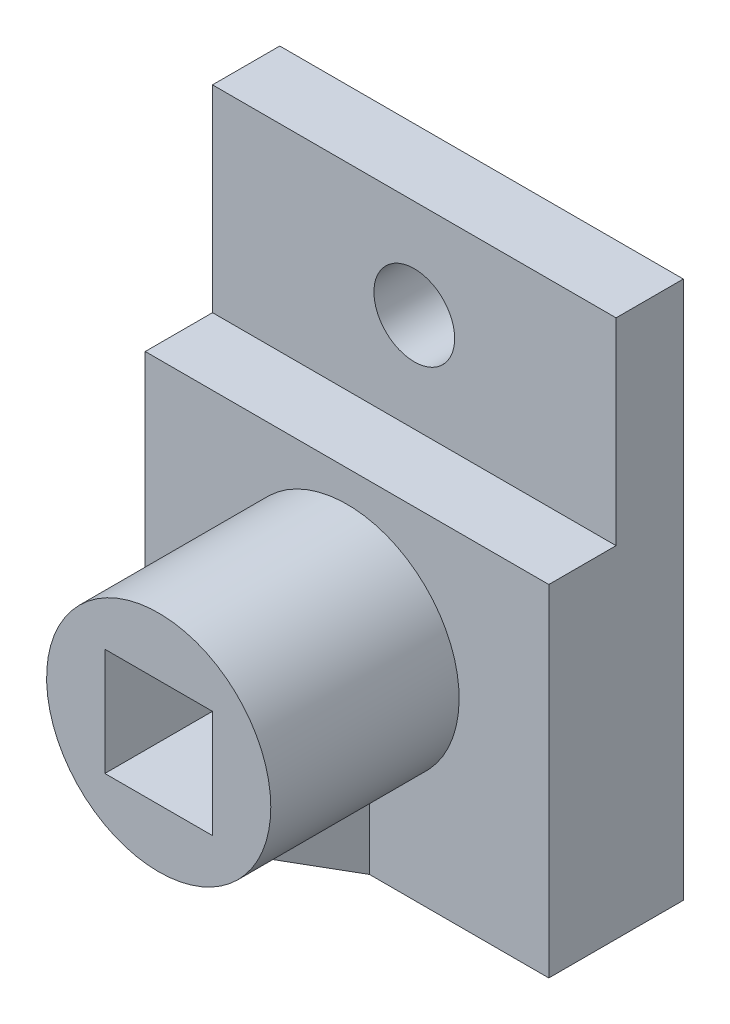
ISO-10303-21;
HEADER;
FILE_DESCRIPTION(('STEP AP214'),'2;1');
FILE_NAME('part.step','',(''),(''),'','','');
FILE_SCHEMA(('AUTOMOTIVE_DESIGN { 1 0 10303 214 1 1 1 1 }'));
ENDSEC;
DATA;
#1=APPLICATION_CONTEXT('core data for automotive mechanical design processes');
#2=APPLICATION_PROTOCOL_DEFINITION('international standard','automotive_design',2000,#1);
#3=PRODUCT_CONTEXT('',#1,'mechanical');
#4=PRODUCT('Part','Part','',(#3));
#5=PRODUCT_RELATED_PRODUCT_CATEGORY('part','',(#4));
#6=PRODUCT_DEFINITION_FORMATION('','',#4);
#7=PRODUCT_DEFINITION_CONTEXT('part definition',#1,'design');
#8=PRODUCT_DEFINITION('design','',#6,#7);
#9=PRODUCT_DEFINITION_SHAPE('','',#8);
#10=(LENGTH_UNIT() NAMED_UNIT(*) SI_UNIT(.MILLI.,.METRE.));
#11=(NAMED_UNIT(*) PLANE_ANGLE_UNIT() SI_UNIT($,.RADIAN.));
#12=(NAMED_UNIT(*) SI_UNIT($,.STERADIAN.) SOLID_ANGLE_UNIT());
#13=UNCERTAINTY_MEASURE_WITH_UNIT(LENGTH_MEASURE(1.E-05),#10,'distance_accuracy_value','');
#14=(GEOMETRIC_REPRESENTATION_CONTEXT(3) GLOBAL_UNCERTAINTY_ASSIGNED_CONTEXT((#13)) GLOBAL_UNIT_ASSIGNED_CONTEXT((#10,
#11,#12)) REPRESENTATION_CONTEXT('',''));
#15=CARTESIAN_POINT('',(0.,0.,0.));
#16=DIRECTION('',(0.,0.,1.));
#17=DIRECTION('',(1.,0.,0.));
#18=AXIS2_PLACEMENT_3D('',#15,#16,#17);
#19=CARTESIAN_POINT('',(0.,0.,15.));
#20=DIRECTION('',(0.,0.,-1.));
#21=DIRECTION('',(-1.,0.,0.));
#22=AXIS2_PLACEMENT_3D('',#19,#20,#21);
#23=PLANE('',#22);
#24=DIRECTION('',(0.,1.,0.));
#25=VECTOR('',#24,1.);
#26=CARTESIAN_POINT('',(22.5,-30.,15.));
#27=LINE('',#26,#25);
#28=CARTESIAN_POINT('',(22.5,-30.,15.));
#29=VERTEX_POINT('',#28);
#30=CARTESIAN_POINT('',(22.5,8.00000000000001,15.));
#31=VERTEX_POINT('',#30);
#32=EDGE_CURVE('E214',#29,#31,#27,.T.);
#33=ORIENTED_EDGE('',*,*,#32,.T.);
#34=DIRECTION('',(1.,0.,0.));
#35=VECTOR('',#34,1.);
#36=CARTESIAN_POINT('',(-22.5,8.00000000000001,15.));
#37=LINE('',#36,#35);
#38=CARTESIAN_POINT('',(-22.5,8.00000000000001,15.));
#39=VERTEX_POINT('',#38);
#40=EDGE_CURVE('E203',#39,#31,#37,.T.);
#41=ORIENTED_EDGE('',*,*,#40,.F.);
#42=DIRECTION('',(0.,-1.,0.));
#43=VECTOR('',#42,1.);
#44=CARTESIAN_POINT('',(-22.5,-30.,15.));
#45=LINE('',#44,#43);
#46=CARTESIAN_POINT('',(-22.5,-30.,15.));
#47=VERTEX_POINT('',#46);
#48=EDGE_CURVE('E217',#39,#47,#45,.T.);
#49=ORIENTED_EDGE('',*,*,#48,.T.);
#50=DIRECTION('',(1.,0.,0.));
#51=VECTOR('',#50,1.);
#52=CARTESIAN_POINT('',(-22.5,-30.,15.));
#53=LINE('',#52,#51);
#54=CARTESIAN_POINT('',(-2.50000000000001,-30.,15.));
#55=VERTEX_POINT('',#54);
#56=EDGE_CURVE('E221',#47,#55,#53,.T.);
#57=ORIENTED_EDGE('',*,*,#56,.T.);
#58=DIRECTION('',(0.,-1.,0.));
#59=VECTOR('',#58,1.);
#60=CARTESIAN_POINT('',(-2.5,0.,15.));
#61=LINE('',#60,#59);
#62=CARTESIAN_POINT('',(-2.5,-20.2474487139159,15.));
#63=VERTEX_POINT('',#62);
#64=EDGE_CURVE('E169',#63,#55,#61,.T.);
#65=ORIENTED_EDGE('',*,*,#64,.F.);
#66=CARTESIAN_POINT('',(0.,-7.99999999999999,15.));
#67=DIRECTION('',(0.,0.,-1.));
#68=DIRECTION('',(-1.,0.,0.));
#69=AXIS2_PLACEMENT_3D('',#66,#67,#68);
#70=CIRCLE('',#69,12.5);
#71=CARTESIAN_POINT('',(2.5,-20.2474487139159,15.));
#72=VERTEX_POINT('',#71);
#73=EDGE_CURVE('E11',#72,#63,#70,.F.);
#74=ORIENTED_EDGE('',*,*,#73,.F.);
#75=DIRECTION('',(0.,-1.,0.));
#76=VECTOR('',#75,1.);
#77=CARTESIAN_POINT('',(2.5,0.,15.));
#78=LINE('',#77,#76);
#79=CARTESIAN_POINT('',(2.49999999999999,-30.,15.));
#80=VERTEX_POINT('',#79);
#81=EDGE_CURVE('E177',#72,#80,#78,.T.);
#82=ORIENTED_EDGE('',*,*,#81,.T.);
#83=EDGE_CURVE('E220',#80,#29,#53,.T.);
#84=ORIENTED_EDGE('',*,*,#83,.T.);
#85=EDGE_LOOP('',(#33,#41,#49,#57,#65,#74,#82,#84));
#86=FACE_BOUND('',#85,.T.);
#87=ADVANCED_FACE('F35',(#86),#23,.F.);
#88=CARTESIAN_POINT('',(22.5,-30.,15.));
#89=DIRECTION('',(-1.,0.,0.));
#90=DIRECTION('',(0.,0.,1.));
#91=AXIS2_PLACEMENT_3D('',#88,#89,#90);
#92=PLANE('',#91);
#93=DIRECTION('',(0.,0.,-1.));
#94=VECTOR('',#93,1.);
#95=CARTESIAN_POINT('',(22.5,30.,15.));
#96=LINE('',#95,#94);
#97=CARTESIAN_POINT('',(22.5,30.,7.5));
#98=VERTEX_POINT('',#97);
#99=CARTESIAN_POINT('',(22.5,30.,0.));
#100=VERTEX_POINT('',#99);
#101=EDGE_CURVE('E43',#98,#100,#96,.T.);
#102=ORIENTED_EDGE('',*,*,#101,.F.);
#103=DIRECTION('',(0.,1.,0.));
#104=VECTOR('',#103,1.);
#105=CARTESIAN_POINT('',(22.5,30.,7.5));
#106=LINE('',#105,#104);
#107=CARTESIAN_POINT('',(22.5,8.00000000000001,7.5));
#108=VERTEX_POINT('',#107);
#109=EDGE_CURVE('E200',#108,#98,#106,.T.);
#110=ORIENTED_EDGE('',*,*,#109,.F.);
#111=DIRECTION('',(0.,0.,-1.));
#112=VECTOR('',#111,1.);
#113=CARTESIAN_POINT('',(22.5,8.00000000000001,15.));
#114=LINE('',#113,#112);
#115=EDGE_CURVE('E195',#31,#108,#114,.T.);
#116=ORIENTED_EDGE('',*,*,#115,.F.);
#117=ORIENTED_EDGE('',*,*,#32,.F.);
#118=DIRECTION('',(0.,0.,-1.));
#119=VECTOR('',#118,1.);
#120=CARTESIAN_POINT('',(22.5,-30.,15.));
#121=LINE('',#120,#119);
#122=CARTESIAN_POINT('',(22.5,-30.,0.));
#123=VERTEX_POINT('',#122);
#124=EDGE_CURVE('E224',#29,#123,#121,.T.);
#125=ORIENTED_EDGE('',*,*,#124,.T.);
#126=DIRECTION('',(0.,1.,0.));
#127=VECTOR('',#126,1.);
#128=CARTESIAN_POINT('',(22.5,-30.,0.));
#129=LINE('',#128,#127);
#130=EDGE_CURVE('E210',#123,#100,#129,.T.);
#131=ORIENTED_EDGE('',*,*,#130,.T.);
#132=EDGE_LOOP('',(#102,#110,#116,#117,#125,#131));
#133=FACE_BOUND('',#132,.T.);
#134=ADVANCED_FACE('F37',(#133),#92,.F.);
#135=CARTESIAN_POINT('',(-22.5,30.,15.));
#136=DIRECTION('',(0.,-1.,0.));
#137=DIRECTION('',(0.,0.,-1.));
#138=AXIS2_PLACEMENT_3D('',#135,#136,#137);
#139=PLANE('',#138);
#140=DIRECTION('',(-1.,0.,0.));
#141=VECTOR('',#140,1.);
#142=CARTESIAN_POINT('',(-22.5,30.,0.));
#143=LINE('',#142,#141);
#144=CARTESIAN_POINT('',(-22.5,30.,0.));
#145=VERTEX_POINT('',#144);
#146=EDGE_CURVE('E227',#100,#145,#143,.T.);
#147=ORIENTED_EDGE('',*,*,#146,.T.);
#148=DIRECTION('',(0.,0.,-1.));
#149=VECTOR('',#148,1.);
#150=CARTESIAN_POINT('',(-22.5,30.,15.));
#151=LINE('',#150,#149);
#152=CARTESIAN_POINT('',(-22.5,30.,7.5));
#153=VERTEX_POINT('',#152);
#154=EDGE_CURVE('E237',#153,#145,#151,.T.);
#155=ORIENTED_EDGE('',*,*,#154,.F.);
#156=DIRECTION('',(1.,0.,0.));
#157=VECTOR('',#156,1.);
#158=CARTESIAN_POINT('',(-22.5,30.,7.5));
#159=LINE('',#158,#157);
#160=EDGE_CURVE('E208',#153,#98,#159,.T.);
#161=ORIENTED_EDGE('',*,*,#160,.T.);
#162=ORIENTED_EDGE('',*,*,#101,.T.);
#163=EDGE_LOOP('',(#147,#155,#161,#162));
#164=FACE_BOUND('',#163,.T.);
#165=ADVANCED_FACE('F242',(#164),#139,.F.);
#166=CARTESIAN_POINT('',(-22.5,-30.,15.));
#167=DIRECTION('',(1.,0.,0.));
#168=DIRECTION('',(0.,0.,-1.));
#169=AXIS2_PLACEMENT_3D('',#166,#167,#168);
#170=PLANE('',#169);
#171=DIRECTION('',(0.,0.,-1.));
#172=VECTOR('',#171,1.);
#173=CARTESIAN_POINT('',(-22.5,8.00000000000001,15.));
#174=LINE('',#173,#172);
#175=CARTESIAN_POINT('',(-22.5,8.00000000000001,7.5));
#176=VERTEX_POINT('',#175);
#177=EDGE_CURVE('E196',#39,#176,#174,.T.);
#178=ORIENTED_EDGE('',*,*,#177,.T.);
#179=DIRECTION('',(0.,1.,0.));
#180=VECTOR('',#179,1.);
#181=CARTESIAN_POINT('',(-22.5,30.,7.5));
#182=LINE('',#181,#180);
#183=EDGE_CURVE('E199',#176,#153,#182,.T.);
#184=ORIENTED_EDGE('',*,*,#183,.T.);
#185=ORIENTED_EDGE('',*,*,#154,.T.);
#186=DIRECTION('',(0.,-1.,0.));
#187=VECTOR('',#186,1.);
#188=CARTESIAN_POINT('',(-22.5,-30.,0.));
#189=LINE('',#188,#187);
#190=CARTESIAN_POINT('',(-22.5,-30.,0.));
#191=VERTEX_POINT('',#190);
#192=EDGE_CURVE('E229',#145,#191,#189,.T.);
#193=ORIENTED_EDGE('',*,*,#192,.T.);
#194=DIRECTION('',(0.,0.,-1.));
#195=VECTOR('',#194,1.);
#196=CARTESIAN_POINT('',(-22.5,-30.,15.));
#197=LINE('',#196,#195);
#198=EDGE_CURVE('E234',#47,#191,#197,.T.);
#199=ORIENTED_EDGE('',*,*,#198,.F.);
#200=ORIENTED_EDGE('',*,*,#48,.F.);
#201=EDGE_LOOP('',(#178,#184,#185,#193,#199,#200));
#202=FACE_BOUND('',#201,.T.);
#203=ADVANCED_FACE('F260',(#202),#170,.F.);
#204=CARTESIAN_POINT('',(-22.5,-30.,15.));
#205=DIRECTION('',(0.,1.,0.));
#206=DIRECTION('',(0.,0.,1.));
#207=AXIS2_PLACEMENT_3D('',#204,#205,#206);
#208=PLANE('',#207);
#209=ORIENTED_EDGE('',*,*,#83,.F.);
#210=DIRECTION('',(1.,0.,0.));
#211=VECTOR('',#210,1.);
#212=CARTESIAN_POINT('',(-22.5,-30.,15.));
#213=LINE('',#212,#211);
#214=EDGE_CURVE('E183',#55,#80,#213,.T.);
#215=ORIENTED_EDGE('',*,*,#214,.F.);
#216=ORIENTED_EDGE('',*,*,#56,.F.);
#217=ORIENTED_EDGE('',*,*,#198,.T.);
#218=DIRECTION('',(1.,0.,0.));
#219=VECTOR('',#218,1.);
#220=CARTESIAN_POINT('',(-22.5,-30.,0.));
#221=LINE('',#220,#219);
#222=EDGE_CURVE('E218',#191,#123,#221,.T.);
#223=ORIENTED_EDGE('',*,*,#222,.T.);
#224=ORIENTED_EDGE('',*,*,#124,.F.);
#225=EDGE_LOOP('',(#209,#215,#216,#217,#223,#224));
#226=FACE_BOUND('',#225,.T.);
#227=ADVANCED_FACE('F255',(#226),#208,.F.);
#228=CARTESIAN_POINT('',(0.,0.,0.));
#229=DIRECTION('',(0.,0.,-1.));
#230=DIRECTION('',(-1.,0.,0.));
#231=AXIS2_PLACEMENT_3D('',#228,#229,#230);
#232=PLANE('',#231);
#233=DIRECTION('',(0.,1.,0.));
#234=VECTOR('',#233,1.);
#235=CARTESIAN_POINT('',(6.,-14.,0.));
#236=LINE('',#235,#234);
#237=CARTESIAN_POINT('',(6.,-14.,0.));
#238=VERTEX_POINT('',#237);
#239=CARTESIAN_POINT('',(6.,-1.99999999999999,0.));
#240=VERTEX_POINT('',#239);
#241=EDGE_CURVE('E131',#238,#240,#236,.T.);
#242=ORIENTED_EDGE('',*,*,#241,.T.);
#243=DIRECTION('',(-1.,0.,0.));
#244=VECTOR('',#243,1.);
#245=CARTESIAN_POINT('',(-6.,-1.99999999999999,0.));
#246=LINE('',#245,#244);
#247=CARTESIAN_POINT('',(-6.,-1.99999999999999,0.));
#248=VERTEX_POINT('',#247);
#249=EDGE_CURVE('E140',#240,#248,#246,.T.);
#250=ORIENTED_EDGE('',*,*,#249,.T.);
#251=DIRECTION('',(0.,-1.,0.));
#252=VECTOR('',#251,1.);
#253=CARTESIAN_POINT('',(-6.,-14.,0.));
#254=LINE('',#253,#252);
#255=CARTESIAN_POINT('',(-6.,-14.,0.));
#256=VERTEX_POINT('',#255);
#257=EDGE_CURVE('E50',#248,#256,#254,.T.);
#258=ORIENTED_EDGE('',*,*,#257,.T.);
#259=DIRECTION('',(1.,0.,0.));
#260=VECTOR('',#259,1.);
#261=CARTESIAN_POINT('',(-6.,-14.,0.));
#262=LINE('',#261,#260);
#263=EDGE_CURVE('E137',#256,#238,#262,.T.);
#264=ORIENTED_EDGE('',*,*,#263,.T.);
#265=EDGE_LOOP('',(#242,#250,#258,#264));
#266=FACE_BOUND('',#265,.T.);
#267=CARTESIAN_POINT('',(0.,19.,0.));
#268=DIRECTION('',(0.,0.,1.));
#269=DIRECTION('',(1.,0.,0.));
#270=AXIS2_PLACEMENT_3D('',#267,#268,#269);
#271=CIRCLE('',#270,4.5);
#272=CARTESIAN_POINT('',(4.5,19.,0.));
#273=VERTEX_POINT('',#272);
#274=EDGE_CURVE('E187',#273,#273,#271,.T.);
#275=ORIENTED_EDGE('',*,*,#274,.T.);
#276=EDGE_LOOP('',(#275));
#277=FACE_BOUND('',#276,.T.);
#278=ORIENTED_EDGE('',*,*,#192,.F.);
#279=ORIENTED_EDGE('',*,*,#146,.F.);
#280=ORIENTED_EDGE('',*,*,#130,.F.);
#281=ORIENTED_EDGE('',*,*,#222,.F.);
#282=EDGE_LOOP('',(#278,#279,#280,#281));
#283=FACE_BOUND('',#282,.T.);
#284=ADVANCED_FACE('F144',(#266,#277,#283),#232,.T.);
#285=CARTESIAN_POINT('',(-22.5,30.,7.5));
#286=DIRECTION('',(0.,0.,-1.));
#287=DIRECTION('',(0.,1.,0.));
#288=AXIS2_PLACEMENT_3D('',#285,#286,#287);
#289=PLANE('',#288);
#290=CARTESIAN_POINT('',(0.,19.,7.5));
#291=DIRECTION('',(0.,0.,1.));
#292=DIRECTION('',(1.,0.,0.));
#293=AXIS2_PLACEMENT_3D('',#290,#291,#292);
#294=CIRCLE('',#293,4.5);
#295=CARTESIAN_POINT('',(4.5,19.,7.5));
#296=VERTEX_POINT('',#295);
#297=EDGE_CURVE('E186',#296,#296,#294,.T.);
#298=ORIENTED_EDGE('',*,*,#297,.F.);
#299=EDGE_LOOP('',(#298));
#300=FACE_BOUND('',#299,.T.);
#301=ORIENTED_EDGE('',*,*,#109,.T.);
#302=ORIENTED_EDGE('',*,*,#160,.F.);
#303=ORIENTED_EDGE('',*,*,#183,.F.);
#304=DIRECTION('',(1.,0.,0.));
#305=VECTOR('',#304,1.);
#306=CARTESIAN_POINT('',(-22.5,8.00000000000001,7.5));
#307=LINE('',#306,#305);
#308=EDGE_CURVE('E211',#176,#108,#307,.T.);
#309=ORIENTED_EDGE('',*,*,#308,.T.);
#310=EDGE_LOOP('',(#301,#302,#303,#309));
#311=FACE_BOUND('',#310,.T.);
#312=ADVANCED_FACE('F263',(#300,#311),#289,.F.);
#313=CARTESIAN_POINT('',(-22.5,8.00000000000001,15.));
#314=DIRECTION('',(0.,-1.,0.));
#315=DIRECTION('',(0.,0.,-1.));
#316=AXIS2_PLACEMENT_3D('',#313,#314,#315);
#317=PLANE('',#316);
#318=ORIENTED_EDGE('',*,*,#115,.T.);
#319=ORIENTED_EDGE('',*,*,#308,.F.);
#320=ORIENTED_EDGE('',*,*,#177,.F.);
#321=ORIENTED_EDGE('',*,*,#40,.T.);
#322=EDGE_LOOP('',(#318,#319,#320,#321));
#323=FACE_BOUND('',#322,.T.);
#324=ADVANCED_FACE('F284',(#323),#317,.F.);
#325=CARTESIAN_POINT('',(0.,-7.99999999999999,36.));
#326=DIRECTION('',(0.,0.,-1.));
#327=DIRECTION('',(-1.,0.,0.));
#328=AXIS2_PLACEMENT_3D('',#325,#326,#327);
#329=CYLINDRICAL_SURFACE('',#328,12.5);
#330=CARTESIAN_POINT('',(0.,-7.99999999999999,36.));
#331=DIRECTION('',(0.,0.,1.));
#332=DIRECTION('',(1.,0.,0.));
#333=AXIS2_PLACEMENT_3D('',#330,#331,#332);
#334=CIRCLE('',#333,12.5);
#335=CARTESIAN_POINT('',(12.5,-7.99999999999999,36.));
#336=VERTEX_POINT('',#335);
#337=EDGE_CURVE('E190',#336,#336,#334,.T.);
#338=ORIENTED_EDGE('',*,*,#337,.F.);
#339=EDGE_LOOP('',(#338));
#340=FACE_BOUND('',#339,.T.);
#341=ORIENTED_EDGE('',*,*,#73,.T.);
#342=DIRECTION('',(0.,0.,-1.));
#343=VECTOR('',#342,1.);
#344=CARTESIAN_POINT('',(-2.5,-20.2474487139159,36.));
#345=LINE('',#344,#343);
#346=CARTESIAN_POINT('',(-2.5,-20.2474487139159,30.3987651885539));
#347=VERTEX_POINT('',#346);
#348=EDGE_CURVE('E174',#347,#63,#345,.T.);
#349=ORIENTED_EDGE('',*,*,#348,.F.);
#350=CARTESIAN_POINT('',(0.,-7.99999999999999,49.7368421052632));
#351=DIRECTION('',(0.,-0.844819075554228,0.535052081184345));
#352=DIRECTION('',(0.,-0.535052081184345,-0.844819075554228));
#353=AXIS2_PLACEMENT_3D('',#350,#351,#352);
#354=ELLIPSE('',#353,23.3622117165325,12.5);
#355=CARTESIAN_POINT('',(2.5,-20.2474487139159,30.3987651885539));
#356=VERTEX_POINT('',#355);
#357=EDGE_CURVE('E181',#347,#356,#354,.T.);
#358=ORIENTED_EDGE('',*,*,#357,.T.);
#359=DIRECTION('',(0.,0.,-1.));
#360=VECTOR('',#359,1.);
#361=CARTESIAN_POINT('',(2.5,-20.2474487139159,36.));
#362=LINE('',#361,#360);
#363=EDGE_CURVE('E179',#356,#72,#362,.T.);
#364=ORIENTED_EDGE('',*,*,#363,.T.);
#365=EDGE_LOOP('',(#341,#349,#358,#364));
#366=FACE_BOUND('',#365,.T.);
#367=ADVANCED_FACE('F281',(#340,#366),#329,.T.);
#368=CARTESIAN_POINT('',(0.,-7.99999999999999,36.));
#369=DIRECTION('',(0.,0.,1.));
#370=DIRECTION('',(1.,0.,0.));
#371=AXIS2_PLACEMENT_3D('',#368,#369,#370);
#372=PLANE('',#371);
#373=DIRECTION('',(0.,1.,0.));
#374=VECTOR('',#373,1.);
#375=CARTESIAN_POINT('',(6.,-14.,36.));
#376=LINE('',#375,#374);
#377=CARTESIAN_POINT('',(6.,-14.,36.));
#378=VERTEX_POINT('',#377);
#379=CARTESIAN_POINT('',(6.,-1.99999999999999,36.));
#380=VERTEX_POINT('',#379);
#381=EDGE_CURVE('E58',#378,#380,#376,.T.);
#382=ORIENTED_EDGE('',*,*,#381,.F.);
#383=DIRECTION('',(1.,0.,0.));
#384=VECTOR('',#383,1.);
#385=CARTESIAN_POINT('',(-6.,-14.,36.));
#386=LINE('',#385,#384);
#387=CARTESIAN_POINT('',(-6.,-14.,36.));
#388=VERTEX_POINT('',#387);
#389=EDGE_CURVE('E147',#388,#378,#386,.T.);
#390=ORIENTED_EDGE('',*,*,#389,.F.);
#391=DIRECTION('',(0.,-1.,0.));
#392=VECTOR('',#391,1.);
#393=CARTESIAN_POINT('',(-6.,-14.,36.));
#394=LINE('',#393,#392);
#395=CARTESIAN_POINT('',(-6.,-1.99999999999999,36.));
#396=VERTEX_POINT('',#395);
#397=EDGE_CURVE('E150',#396,#388,#394,.T.);
#398=ORIENTED_EDGE('',*,*,#397,.F.);
#399=DIRECTION('',(-1.,0.,0.));
#400=VECTOR('',#399,1.);
#401=CARTESIAN_POINT('',(-6.,-1.99999999999999,36.));
#402=LINE('',#401,#400);
#403=EDGE_CURVE('E156',#380,#396,#402,.T.);
#404=ORIENTED_EDGE('',*,*,#403,.F.);
#405=EDGE_LOOP('',(#382,#390,#398,#404));
#406=FACE_BOUND('',#405,.T.);
#407=ORIENTED_EDGE('',*,*,#337,.T.);
#408=EDGE_LOOP('',(#407));
#409=FACE_BOUND('',#408,.T.);
#410=ADVANCED_FACE('F283',(#406,#409),#372,.T.);
#411=CARTESIAN_POINT('',(0.,19.,0.));
#412=DIRECTION('',(0.,0.,1.));
#413=DIRECTION('',(1.,0.,0.));
#414=AXIS2_PLACEMENT_3D('',#411,#412,#413);
#415=CYLINDRICAL_SURFACE('',#414,4.5);
#416=ORIENTED_EDGE('',*,*,#274,.F.);
#417=EDGE_LOOP('',(#416));
#418=FACE_BOUND('',#417,.T.);
#419=ORIENTED_EDGE('',*,*,#297,.T.);
#420=EDGE_LOOP('',(#419));
#421=FACE_BOUND('',#420,.T.);
#422=ADVANCED_FACE('F291',(#418,#421),#415,.F.);
#423=CARTESIAN_POINT('',(0.,-20.5,30.));
#424=DIRECTION('',(0.,-0.844819075554228,0.535052081184345));
#425=DIRECTION('',(0.,-0.535052081184345,-0.844819075554228));
#426=AXIS2_PLACEMENT_3D('',#423,#424,#425);
#427=PLANE('',#426);
#428=DIRECTION('',(0.,-0.535052081184345,-0.844819075554228));
#429=VECTOR('',#428,1.);
#430=CARTESIAN_POINT('',(-2.5,-20.5,30.));
#431=LINE('',#430,#429);
#432=EDGE_CURVE('E162',#347,#55,#431,.T.);
#433=ORIENTED_EDGE('',*,*,#432,.T.);
#434=ORIENTED_EDGE('',*,*,#214,.T.);
#435=DIRECTION('',(0.,-0.535052081184345,-0.844819075554228));
#436=VECTOR('',#435,1.);
#437=CARTESIAN_POINT('',(2.5,-20.5,30.));
#438=LINE('',#437,#436);
#439=EDGE_CURVE('E166',#356,#80,#438,.T.);
#440=ORIENTED_EDGE('',*,*,#439,.F.);
#441=ORIENTED_EDGE('',*,*,#357,.F.);
#442=EDGE_LOOP('',(#433,#434,#440,#441));
#443=FACE_BOUND('',#442,.T.);
#444=ADVANCED_FACE('F276',(#443),#427,.T.);
#445=CARTESIAN_POINT('',(2.5,0.,18.));
#446=DIRECTION('',(1.,0.,0.));
#447=DIRECTION('',(0.,0.,-1.));
#448=AXIS2_PLACEMENT_3D('',#445,#446,#447);
#449=PLANE('',#448);
#450=ORIENTED_EDGE('',*,*,#363,.F.);
#451=ORIENTED_EDGE('',*,*,#439,.T.);
#452=ORIENTED_EDGE('',*,*,#81,.F.);
#453=EDGE_LOOP('',(#450,#451,#452));
#454=FACE_BOUND('',#453,.T.);
#455=ADVANCED_FACE('F272',(#454),#449,.T.);
#456=CARTESIAN_POINT('',(-2.5,0.,18.));
#457=DIRECTION('',(1.,0.,0.));
#458=DIRECTION('',(0.,0.,-1.));
#459=AXIS2_PLACEMENT_3D('',#456,#457,#458);
#460=PLANE('',#459);
#461=ORIENTED_EDGE('',*,*,#432,.F.);
#462=ORIENTED_EDGE('',*,*,#348,.T.);
#463=ORIENTED_EDGE('',*,*,#64,.T.);
#464=EDGE_LOOP('',(#461,#462,#463));
#465=FACE_BOUND('',#464,.T.);
#466=ADVANCED_FACE('F279',(#465),#460,.F.);
#467=CARTESIAN_POINT('',(6.,-14.,0.));
#468=DIRECTION('',(1.,0.,0.));
#469=DIRECTION('',(0.,0.,-1.));
#470=AXIS2_PLACEMENT_3D('',#467,#468,#469);
#471=PLANE('',#470);
#472=ORIENTED_EDGE('',*,*,#381,.T.);
#473=DIRECTION('',(0.,0.,1.));
#474=VECTOR('',#473,1.);
#475=CARTESIAN_POINT('',(6.,-1.99999999999999,0.));
#476=LINE('',#475,#474);
#477=EDGE_CURVE('E127',#240,#380,#476,.T.);
#478=ORIENTED_EDGE('',*,*,#477,.F.);
#479=ORIENTED_EDGE('',*,*,#241,.F.);
#480=DIRECTION('',(0.,0.,1.));
#481=VECTOR('',#480,1.);
#482=CARTESIAN_POINT('',(6.,-14.,0.));
#483=LINE('',#482,#481);
#484=EDGE_CURVE('E160',#238,#378,#483,.T.);
#485=ORIENTED_EDGE('',*,*,#484,.T.);
#486=EDGE_LOOP('',(#472,#478,#479,#485));
#487=FACE_BOUND('',#486,.T.);
#488=ADVANCED_FACE('F129',(#487),#471,.F.);
#489=CARTESIAN_POINT('',(-6.,-14.,0.));
#490=DIRECTION('',(0.,-1.,0.));
#491=DIRECTION('',(0.,0.,-1.));
#492=AXIS2_PLACEMENT_3D('',#489,#490,#491);
#493=PLANE('',#492);
#494=ORIENTED_EDGE('',*,*,#389,.T.);
#495=ORIENTED_EDGE('',*,*,#484,.F.);
#496=ORIENTED_EDGE('',*,*,#263,.F.);
#497=DIRECTION('',(0.,0.,1.));
#498=VECTOR('',#497,1.);
#499=CARTESIAN_POINT('',(-6.,-14.,0.));
#500=LINE('',#499,#498);
#501=EDGE_CURVE('E163',#256,#388,#500,.T.);
#502=ORIENTED_EDGE('',*,*,#501,.T.);
#503=EDGE_LOOP('',(#494,#495,#496,#502));
#504=FACE_BOUND('',#503,.T.);
#505=ADVANCED_FACE('F384',(#504),#493,.F.);
#506=CARTESIAN_POINT('',(-6.,-14.,0.));
#507=DIRECTION('',(-1.,0.,0.));
#508=DIRECTION('',(0.,0.,1.));
#509=AXIS2_PLACEMENT_3D('',#506,#507,#508);
#510=PLANE('',#509);
#511=ORIENTED_EDGE('',*,*,#397,.T.);
#512=ORIENTED_EDGE('',*,*,#501,.F.);
#513=ORIENTED_EDGE('',*,*,#257,.F.);
#514=DIRECTION('',(0.,0.,1.));
#515=VECTOR('',#514,1.);
#516=CARTESIAN_POINT('',(-6.,-1.99999999999999,0.));
#517=LINE('',#516,#515);
#518=EDGE_CURVE('E136',#248,#396,#517,.T.);
#519=ORIENTED_EDGE('',*,*,#518,.T.);
#520=EDGE_LOOP('',(#511,#512,#513,#519));
#521=FACE_BOUND('',#520,.T.);
#522=ADVANCED_FACE('F390',(#521),#510,.F.);
#523=CARTESIAN_POINT('',(-6.,-1.99999999999999,0.));
#524=DIRECTION('',(0.,1.,0.));
#525=DIRECTION('',(0.,0.,1.));
#526=AXIS2_PLACEMENT_3D('',#523,#524,#525);
#527=PLANE('',#526);
#528=ORIENTED_EDGE('',*,*,#403,.T.);
#529=ORIENTED_EDGE('',*,*,#518,.F.);
#530=ORIENTED_EDGE('',*,*,#249,.F.);
#531=ORIENTED_EDGE('',*,*,#477,.T.);
#532=EDGE_LOOP('',(#528,#529,#530,#531));
#533=FACE_BOUND('',#532,.T.);
#534=ADVANCED_FACE('F141',(#533),#527,.F.);
#535=CLOSED_SHELL('',(#87,#134,#165,#203,#227,#284,#312,#324,#367,#410,#422,#444,#455,#466,#488,
#505,#522,#534));
#536=MANIFOLD_SOLID_BREP('B2',#535);
#537=ADVANCED_BREP_SHAPE_REPRESENTATION('',(#18,#536),#14);
#538=SHAPE_DEFINITION_REPRESENTATION(#9,#537);
ENDSEC;
END-ISO-10303-21;
